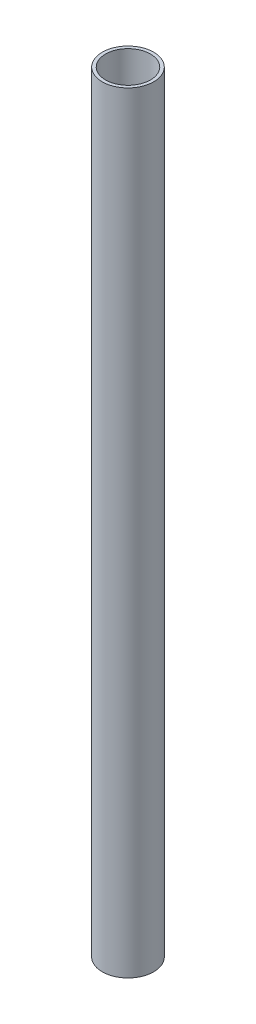
ISO-10303-21;
HEADER;
FILE_DESCRIPTION(('STEP AP214'),'2;1');
FILE_NAME('part.step','',(''),(''),'','','');
FILE_SCHEMA(('AUTOMOTIVE_DESIGN { 1 0 10303 214 1 1 1 1 }'));
ENDSEC;
DATA;
#1=APPLICATION_CONTEXT('core data for automotive mechanical design processes');
#2=APPLICATION_PROTOCOL_DEFINITION('international standard','automotive_design',2000,#1);
#3=PRODUCT_CONTEXT('',#1,'mechanical');
#4=PRODUCT('Part','Part','',(#3));
#5=PRODUCT_RELATED_PRODUCT_CATEGORY('part','',(#4));
#6=PRODUCT_DEFINITION_FORMATION('','',#4);
#7=PRODUCT_DEFINITION_CONTEXT('part definition',#1,'design');
#8=PRODUCT_DEFINITION('design','',#6,#7);
#9=PRODUCT_DEFINITION_SHAPE('','',#8);
#10=(LENGTH_UNIT() NAMED_UNIT(*) SI_UNIT(.MILLI.,.METRE.));
#11=(NAMED_UNIT(*) PLANE_ANGLE_UNIT() SI_UNIT($,.RADIAN.));
#12=(NAMED_UNIT(*) SI_UNIT($,.STERADIAN.) SOLID_ANGLE_UNIT());
#13=UNCERTAINTY_MEASURE_WITH_UNIT(LENGTH_MEASURE(1.E-05),#10,'distance_accuracy_value','');
#14=(GEOMETRIC_REPRESENTATION_CONTEXT(3) GLOBAL_UNCERTAINTY_ASSIGNED_CONTEXT((#13)) GLOBAL_UNIT_ASSIGNED_CONTEXT((#10,
#11,#12)) REPRESENTATION_CONTEXT('',''));
#15=CARTESIAN_POINT('',(0.,0.,0.));
#16=DIRECTION('',(0.,0.,1.));
#17=DIRECTION('',(1.,0.,0.));
#18=AXIS2_PLACEMENT_3D('',#15,#16,#17);
#19=CARTESIAN_POINT('',(0.,120.,0.));
#20=DIRECTION('',(0.,1.,0.));
#21=DIRECTION('',(0.,0.,1.));
#22=AXIS2_PLACEMENT_3D('',#19,#20,#21);
#23=PLANE('',#22);
#24=CARTESIAN_POINT('',(0.,120.,0.));
#25=DIRECTION('',(0.,1.,0.));
#26=DIRECTION('',(0.,0.,1.));
#27=AXIS2_PLACEMENT_3D('',#24,#25,#26);
#28=CIRCLE('',#27,8.);
#29=CARTESIAN_POINT('',(0.,120.,8.));
#30=VERTEX_POINT('',#29);
#31=EDGE_CURVE('E10',#30,#30,#28,.T.);
#32=ORIENTED_EDGE('',*,*,#31,.T.);
#33=EDGE_LOOP('',(#32));
#34=FACE_BOUND('',#33,.T.);
#35=CARTESIAN_POINT('',(0.,120.,0.));
#36=DIRECTION('',(0.,1.,0.));
#37=DIRECTION('',(0.,0.,1.));
#38=AXIS2_PLACEMENT_3D('',#35,#36,#37);
#39=CIRCLE('',#38,7.00000000000001);
#40=CARTESIAN_POINT('',(0.,120.,7.00000000000001));
#41=VERTEX_POINT('',#40);
#42=EDGE_CURVE('E48',#41,#41,#39,.T.);
#43=ORIENTED_EDGE('',*,*,#42,.F.);
#44=EDGE_LOOP('',(#43));
#45=FACE_BOUND('',#44,.T.);
#46=ADVANCED_FACE('F40',(#34,#45),#23,.T.);
#47=CARTESIAN_POINT('',(0.,-120.,0.));
#48=DIRECTION('',(0.,1.,0.));
#49=DIRECTION('',(0.,0.,1.));
#50=AXIS2_PLACEMENT_3D('',#47,#48,#49);
#51=PLANE('',#50);
#52=CARTESIAN_POINT('',(0.,-120.,0.));
#53=DIRECTION('',(0.,1.,0.));
#54=DIRECTION('',(0.,0.,1.));
#55=AXIS2_PLACEMENT_3D('',#52,#53,#54);
#56=CIRCLE('',#55,8.);
#57=CARTESIAN_POINT('',(0.,-120.,8.));
#58=VERTEX_POINT('',#57);
#59=EDGE_CURVE('E41',#58,#58,#56,.T.);
#60=ORIENTED_EDGE('',*,*,#59,.F.);
#61=EDGE_LOOP('',(#60));
#62=FACE_BOUND('',#61,.T.);
#63=CARTESIAN_POINT('',(0.,-120.,0.));
#64=DIRECTION('',(0.,1.,0.));
#65=DIRECTION('',(0.,0.,1.));
#66=AXIS2_PLACEMENT_3D('',#63,#64,#65);
#67=CIRCLE('',#66,7.00000000000001);
#68=CARTESIAN_POINT('',(0.,-120.,7.00000000000001));
#69=VERTEX_POINT('',#68);
#70=EDGE_CURVE('E49',#69,#69,#67,.T.);
#71=ORIENTED_EDGE('',*,*,#70,.T.);
#72=EDGE_LOOP('',(#71));
#73=FACE_BOUND('',#72,.T.);
#74=ADVANCED_FACE('F58',(#62,#73),#51,.F.);
#75=CARTESIAN_POINT('',(0.,120.,0.));
#76=DIRECTION('',(0.,-1.,0.));
#77=DIRECTION('',(0.,0.,-1.));
#78=AXIS2_PLACEMENT_3D('',#75,#76,#77);
#79=CYLINDRICAL_SURFACE('',#78,8.);
#80=ORIENTED_EDGE('',*,*,#31,.F.);
#81=EDGE_LOOP('',(#80));
#82=FACE_BOUND('',#81,.T.);
#83=ORIENTED_EDGE('',*,*,#59,.T.);
#84=EDGE_LOOP('',(#83));
#85=FACE_BOUND('',#84,.T.);
#86=ADVANCED_FACE('F39',(#82,#85),#79,.T.);
#87=CARTESIAN_POINT('',(0.,120.,0.));
#88=DIRECTION('',(0.,-1.,0.));
#89=DIRECTION('',(0.,0.,-1.));
#90=AXIS2_PLACEMENT_3D('',#87,#88,#89);
#91=CYLINDRICAL_SURFACE('',#90,7.00000000000001);
#92=ORIENTED_EDGE('',*,*,#42,.T.);
#93=EDGE_LOOP('',(#92));
#94=FACE_BOUND('',#93,.T.);
#95=ORIENTED_EDGE('',*,*,#70,.F.);
#96=EDGE_LOOP('',(#95));
#97=FACE_BOUND('',#96,.T.);
#98=ADVANCED_FACE('F57',(#94,#97),#91,.F.);
#99=CLOSED_SHELL('',(#46,#74,#86,#98));
#100=MANIFOLD_SOLID_BREP('B2',#99);
#101=ADVANCED_BREP_SHAPE_REPRESENTATION('',(#18,#100),#14);
#102=SHAPE_DEFINITION_REPRESENTATION(#9,#101);
ENDSEC;
END-ISO-10303-21;
